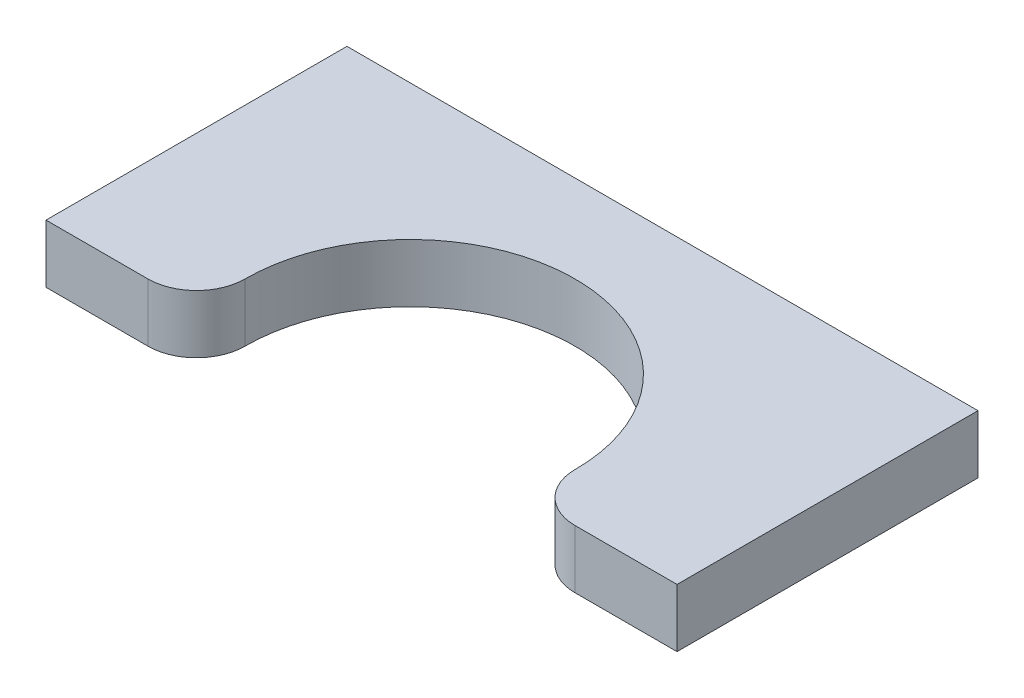
ISO-10303-21;
HEADER;
FILE_DESCRIPTION(('STEP AP214'),'2;1');
FILE_NAME('part.step','',(''),(''),'','','');
FILE_SCHEMA(('AUTOMOTIVE_DESIGN { 1 0 10303 214 1 1 1 1 }'));
ENDSEC;
DATA;
#1=APPLICATION_CONTEXT('core data for automotive mechanical design processes');
#2=APPLICATION_PROTOCOL_DEFINITION('international standard','automotive_design',2000,#1);
#3=PRODUCT_CONTEXT('',#1,'mechanical');
#4=PRODUCT('Part','Part','',(#3));
#5=PRODUCT_RELATED_PRODUCT_CATEGORY('part','',(#4));
#6=PRODUCT_DEFINITION_FORMATION('','',#4);
#7=PRODUCT_DEFINITION_CONTEXT('part definition',#1,'design');
#8=PRODUCT_DEFINITION('design','',#6,#7);
#9=PRODUCT_DEFINITION_SHAPE('','',#8);
#10=(LENGTH_UNIT() NAMED_UNIT(*) SI_UNIT(.MILLI.,.METRE.));
#11=(NAMED_UNIT(*) PLANE_ANGLE_UNIT() SI_UNIT($,.RADIAN.));
#12=(NAMED_UNIT(*) SI_UNIT($,.STERADIAN.) SOLID_ANGLE_UNIT());
#13=UNCERTAINTY_MEASURE_WITH_UNIT(LENGTH_MEASURE(1.E-05),#10,'distance_accuracy_value','');
#14=(GEOMETRIC_REPRESENTATION_CONTEXT(3) GLOBAL_UNCERTAINTY_ASSIGNED_CONTEXT((#13)) GLOBAL_UNIT_ASSIGNED_CONTEXT((#10,
#11,#12)) REPRESENTATION_CONTEXT('',''));
#15=CARTESIAN_POINT('',(0.,0.,0.));
#16=DIRECTION('',(0.,0.,1.));
#17=DIRECTION('',(1.,0.,0.));
#18=AXIS2_PLACEMENT_3D('',#15,#16,#17);
#19=CARTESIAN_POINT('',(32.5,-3.,15.5));
#20=DIRECTION('',(1.,0.,0.));
#21=DIRECTION('',(0.,0.,-1.));
#22=AXIS2_PLACEMENT_3D('',#19,#20,#21);
#23=PLANE('',#22);
#24=DIRECTION('',(0.,1.,0.));
#25=VECTOR('',#24,1.);
#26=CARTESIAN_POINT('',(32.5,-3.,-15.5));
#27=LINE('',#26,#25);
#28=CARTESIAN_POINT('',(32.5,-3.,-15.5));
#29=VERTEX_POINT('',#28);
#30=CARTESIAN_POINT('',(32.5,3.,-15.5));
#31=VERTEX_POINT('',#30);
#32=EDGE_CURVE('E102',#29,#31,#27,.T.);
#33=ORIENTED_EDGE('',*,*,#32,.T.);
#34=DIRECTION('',(0.,0.,-1.));
#35=VECTOR('',#34,1.);
#36=CARTESIAN_POINT('',(32.5,3.,15.5));
#37=LINE('',#36,#35);
#38=CARTESIAN_POINT('',(32.5,3.,15.5));
#39=VERTEX_POINT('',#38);
#40=EDGE_CURVE('E106',#39,#31,#37,.T.);
#41=ORIENTED_EDGE('',*,*,#40,.F.);
#42=DIRECTION('',(0.,1.,0.));
#43=VECTOR('',#42,1.);
#44=CARTESIAN_POINT('',(32.5,-3.,15.5));
#45=LINE('',#44,#43);
#46=CARTESIAN_POINT('',(32.5,-3.,15.5));
#47=VERTEX_POINT('',#46);
#48=EDGE_CURVE('E148',#47,#39,#45,.T.);
#49=ORIENTED_EDGE('',*,*,#48,.F.);
#50=DIRECTION('',(0.,0.,-1.));
#51=VECTOR('',#50,1.);
#52=CARTESIAN_POINT('',(32.5,-3.,15.5));
#53=LINE('',#52,#51);
#54=EDGE_CURVE('E108',#47,#29,#53,.T.);
#55=ORIENTED_EDGE('',*,*,#54,.T.);
#56=EDGE_LOOP('',(#33,#41,#49,#55));
#57=FACE_BOUND('',#56,.T.);
#58=ADVANCED_FACE('F34',(#57),#23,.T.);
#59=CARTESIAN_POINT('',(16.2480768092719,-3.,15.5));
#60=DIRECTION('',(0.,0.,1.));
#61=DIRECTION('',(1.,0.,0.));
#62=AXIS2_PLACEMENT_3D('',#59,#60,#61);
#63=PLANE('',#62);
#64=DIRECTION('',(1.,0.,0.));
#65=VECTOR('',#64,1.);
#66=CARTESIAN_POINT('',(16.2480768092719,3.,15.5));
#67=LINE('',#66,#65);
#68=CARTESIAN_POINT('',(22.,3.,15.5));
#69=VERTEX_POINT('',#68);
#70=EDGE_CURVE('E125',#69,#39,#67,.T.);
#71=ORIENTED_EDGE('',*,*,#70,.F.);
#72=DIRECTION('',(0.,1.,0.));
#73=VECTOR('',#72,1.);
#74=CARTESIAN_POINT('',(22.,-3.,15.5));
#75=LINE('',#74,#73);
#76=CARTESIAN_POINT('',(22.,-3.,15.5));
#77=VERTEX_POINT('',#76);
#78=EDGE_CURVE('E57',#69,#77,#75,.F.);
#79=ORIENTED_EDGE('',*,*,#78,.T.);
#80=DIRECTION('',(1.,0.,0.));
#81=VECTOR('',#80,1.);
#82=CARTESIAN_POINT('',(16.2480768092719,-3.,15.5));
#83=LINE('',#82,#81);
#84=EDGE_CURVE('E113',#77,#47,#83,.T.);
#85=ORIENTED_EDGE('',*,*,#84,.T.);
#86=ORIENTED_EDGE('',*,*,#48,.T.);
#87=EDGE_LOOP('',(#71,#79,#85,#86));
#88=FACE_BOUND('',#87,.T.);
#89=ADVANCED_FACE('F172',(#88),#63,.T.);
#90=CARTESIAN_POINT('',(0.,-3.,10.5));
#91=DIRECTION('',(0.,1.,0.));
#92=DIRECTION('',(0.,0.,1.));
#93=AXIS2_PLACEMENT_3D('',#90,#91,#92);
#94=CYLINDRICAL_SURFACE('',#93,17.);
#95=CARTESIAN_POINT('',(0.,-3.,10.5));
#96=DIRECTION('',(0.,-1.,0.));
#97=DIRECTION('',(0.,0.,1.));
#98=AXIS2_PLACEMENT_3D('',#95,#96,#97);
#99=CIRCLE('',#98,17.);
#100=CARTESIAN_POINT('',(-17.,-3.,10.5));
#101=VERTEX_POINT('',#100);
#102=CARTESIAN_POINT('',(17.,-3.,10.5));
#103=VERTEX_POINT('',#102);
#104=EDGE_CURVE('E144',#101,#103,#99,.T.);
#105=ORIENTED_EDGE('',*,*,#104,.T.);
#106=DIRECTION('',(0.,1.,0.));
#107=VECTOR('',#106,1.);
#108=CARTESIAN_POINT('',(17.,-3.,10.5));
#109=LINE('',#108,#107);
#110=CARTESIAN_POINT('',(17.,3.,10.5));
#111=VERTEX_POINT('',#110);
#112=EDGE_CURVE('E155',#103,#111,#109,.T.);
#113=ORIENTED_EDGE('',*,*,#112,.T.);
#114=CARTESIAN_POINT('',(0.,3.,10.5));
#115=DIRECTION('',(0.,-1.,0.));
#116=DIRECTION('',(0.,0.,1.));
#117=AXIS2_PLACEMENT_3D('',#114,#115,#116);
#118=CIRCLE('',#117,17.);
#119=CARTESIAN_POINT('',(-17.,3.,10.5));
#120=VERTEX_POINT('',#119);
#121=EDGE_CURVE('E133',#120,#111,#118,.T.);
#122=ORIENTED_EDGE('',*,*,#121,.F.);
#123=DIRECTION('',(0.,1.,0.));
#124=VECTOR('',#123,1.);
#125=CARTESIAN_POINT('',(-17.,-3.,10.5));
#126=LINE('',#125,#124);
#127=EDGE_CURVE('E150',#120,#101,#126,.F.);
#128=ORIENTED_EDGE('',*,*,#127,.T.);
#129=EDGE_LOOP('',(#105,#113,#122,#128));
#130=FACE_BOUND('',#129,.T.);
#131=ADVANCED_FACE('F168',(#130),#94,.F.);
#132=CARTESIAN_POINT('',(-32.5,-3.,15.5));
#133=DIRECTION('',(0.,0.,1.));
#134=DIRECTION('',(1.,0.,0.));
#135=AXIS2_PLACEMENT_3D('',#132,#133,#134);
#136=PLANE('',#135);
#137=DIRECTION('',(1.,0.,0.));
#138=VECTOR('',#137,1.);
#139=CARTESIAN_POINT('',(-32.5,-3.,15.5));
#140=LINE('',#139,#138);
#141=CARTESIAN_POINT('',(-32.5,-3.,15.5));
#142=VERTEX_POINT('',#141);
#143=CARTESIAN_POINT('',(-22.,-3.,15.5));
#144=VERTEX_POINT('',#143);
#145=EDGE_CURVE('E142',#142,#144,#140,.T.);
#146=ORIENTED_EDGE('',*,*,#145,.T.);
#147=DIRECTION('',(0.,1.,0.));
#148=VECTOR('',#147,1.);
#149=CARTESIAN_POINT('',(-22.,-3.,15.5));
#150=LINE('',#149,#148);
#151=CARTESIAN_POINT('',(-22.,3.,15.5));
#152=VERTEX_POINT('',#151);
#153=EDGE_CURVE('E11',#144,#152,#150,.T.);
#154=ORIENTED_EDGE('',*,*,#153,.T.);
#155=DIRECTION('',(1.,0.,0.));
#156=VECTOR('',#155,1.);
#157=CARTESIAN_POINT('',(-32.5,3.,15.5));
#158=LINE('',#157,#156);
#159=CARTESIAN_POINT('',(-32.5,3.,15.5));
#160=VERTEX_POINT('',#159);
#161=EDGE_CURVE('E130',#160,#152,#158,.T.);
#162=ORIENTED_EDGE('',*,*,#161,.F.);
#163=DIRECTION('',(0.,1.,0.));
#164=VECTOR('',#163,1.);
#165=CARTESIAN_POINT('',(-32.5,-3.,15.5));
#166=LINE('',#165,#164);
#167=EDGE_CURVE('E151',#142,#160,#166,.T.);
#168=ORIENTED_EDGE('',*,*,#167,.F.);
#169=EDGE_LOOP('',(#146,#154,#162,#168));
#170=FACE_BOUND('',#169,.T.);
#171=ADVANCED_FACE('F178',(#170),#136,.T.);
#172=CARTESIAN_POINT('',(-32.5,-3.,15.5));
#173=DIRECTION('',(-1.,0.,0.));
#174=DIRECTION('',(0.,0.,1.));
#175=AXIS2_PLACEMENT_3D('',#172,#173,#174);
#176=PLANE('',#175);
#177=ORIENTED_EDGE('',*,*,#167,.T.);
#178=DIRECTION('',(0.,0.,1.));
#179=VECTOR('',#178,1.);
#180=CARTESIAN_POINT('',(-32.5,3.,15.5));
#181=LINE('',#180,#179);
#182=CARTESIAN_POINT('',(-32.5,3.,-15.5));
#183=VERTEX_POINT('',#182);
#184=EDGE_CURVE('E121',#183,#160,#181,.T.);
#185=ORIENTED_EDGE('',*,*,#184,.F.);
#186=DIRECTION('',(0.,1.,0.));
#187=VECTOR('',#186,1.);
#188=CARTESIAN_POINT('',(-32.5,-3.,-15.5));
#189=LINE('',#188,#187);
#190=CARTESIAN_POINT('',(-32.5,-3.,-15.5));
#191=VERTEX_POINT('',#190);
#192=EDGE_CURVE('E112',#191,#183,#189,.T.);
#193=ORIENTED_EDGE('',*,*,#192,.F.);
#194=DIRECTION('',(0.,0.,1.));
#195=VECTOR('',#194,1.);
#196=CARTESIAN_POINT('',(-32.5,-3.,15.5));
#197=LINE('',#196,#195);
#198=EDGE_CURVE('E139',#191,#142,#197,.T.);
#199=ORIENTED_EDGE('',*,*,#198,.T.);
#200=EDGE_LOOP('',(#177,#185,#193,#199));
#201=FACE_BOUND('',#200,.T.);
#202=ADVANCED_FACE('F175',(#201),#176,.T.);
#203=CARTESIAN_POINT('',(-32.5,-3.,-15.5));
#204=DIRECTION('',(0.,0.,-1.));
#205=DIRECTION('',(-1.,0.,0.));
#206=AXIS2_PLACEMENT_3D('',#203,#204,#205);
#207=PLANE('',#206);
#208=ORIENTED_EDGE('',*,*,#192,.T.);
#209=DIRECTION('',(-1.,0.,0.));
#210=VECTOR('',#209,1.);
#211=CARTESIAN_POINT('',(-32.5,3.,-15.5));
#212=LINE('',#211,#210);
#213=EDGE_CURVE('E116',#31,#183,#212,.T.);
#214=ORIENTED_EDGE('',*,*,#213,.F.);
#215=ORIENTED_EDGE('',*,*,#32,.F.);
#216=DIRECTION('',(-1.,0.,0.));
#217=VECTOR('',#216,1.);
#218=CARTESIAN_POINT('',(-32.5,-3.,-15.5));
#219=LINE('',#218,#217);
#220=EDGE_CURVE('E137',#29,#191,#219,.T.);
#221=ORIENTED_EDGE('',*,*,#220,.T.);
#222=EDGE_LOOP('',(#208,#214,#215,#221));
#223=FACE_BOUND('',#222,.T.);
#224=ADVANCED_FACE('F117',(#223),#207,.T.);
#225=CARTESIAN_POINT('',(0.,-3.,10.5));
#226=DIRECTION('',(0.,1.,0.));
#227=DIRECTION('',(0.,0.,1.));
#228=AXIS2_PLACEMENT_3D('',#225,#226,#227);
#229=PLANE('',#228);
#230=ORIENTED_EDGE('',*,*,#84,.F.);
#231=CARTESIAN_POINT('',(22.,-3.,10.5));
#232=DIRECTION('',(0.,1.,0.));
#233=DIRECTION('',(0.,0.,1.));
#234=AXIS2_PLACEMENT_3D('',#231,#232,#233);
#235=CIRCLE('',#234,5.);
#236=EDGE_CURVE('E42',#77,#103,#235,.F.);
#237=ORIENTED_EDGE('',*,*,#236,.T.);
#238=ORIENTED_EDGE('',*,*,#104,.F.);
#239=CARTESIAN_POINT('',(-22.,-3.,10.5));
#240=DIRECTION('',(0.,1.,0.));
#241=DIRECTION('',(0.,0.,1.));
#242=AXIS2_PLACEMENT_3D('',#239,#240,#241);
#243=CIRCLE('',#242,5.);
#244=EDGE_CURVE('E49',#101,#144,#243,.F.);
#245=ORIENTED_EDGE('',*,*,#244,.T.);
#246=ORIENTED_EDGE('',*,*,#145,.F.);
#247=ORIENTED_EDGE('',*,*,#198,.F.);
#248=ORIENTED_EDGE('',*,*,#220,.F.);
#249=ORIENTED_EDGE('',*,*,#54,.F.);
#250=EDGE_LOOP('',(#230,#237,#238,#245,#246,#247,#248,#249));
#251=FACE_BOUND('',#250,.T.);
#252=ADVANCED_FACE('F164',(#251),#229,.F.);
#253=CARTESIAN_POINT('',(0.,3.,10.5));
#254=DIRECTION('',(0.,1.,0.));
#255=DIRECTION('',(0.,0.,1.));
#256=AXIS2_PLACEMENT_3D('',#253,#254,#255);
#257=PLANE('',#256);
#258=ORIENTED_EDGE('',*,*,#121,.T.);
#259=CARTESIAN_POINT('',(22.,3.,10.5));
#260=DIRECTION('',(0.,1.,0.));
#261=DIRECTION('',(0.,0.,1.));
#262=AXIS2_PLACEMENT_3D('',#259,#260,#261);
#263=CIRCLE('',#262,5.);
#264=EDGE_CURVE('E160',#111,#69,#263,.T.);
#265=ORIENTED_EDGE('',*,*,#264,.T.);
#266=ORIENTED_EDGE('',*,*,#70,.T.);
#267=ORIENTED_EDGE('',*,*,#40,.T.);
#268=ORIENTED_EDGE('',*,*,#213,.T.);
#269=ORIENTED_EDGE('',*,*,#184,.T.);
#270=ORIENTED_EDGE('',*,*,#161,.T.);
#271=CARTESIAN_POINT('',(-22.,3.,10.5));
#272=DIRECTION('',(0.,1.,0.));
#273=DIRECTION('',(0.,0.,1.));
#274=AXIS2_PLACEMENT_3D('',#271,#272,#273);
#275=CIRCLE('',#274,5.);
#276=EDGE_CURVE('E158',#152,#120,#275,.T.);
#277=ORIENTED_EDGE('',*,*,#276,.T.);
#278=EDGE_LOOP('',(#258,#265,#266,#267,#268,#269,#270,#277));
#279=FACE_BOUND('',#278,.T.);
#280=ADVANCED_FACE('F124',(#279),#257,.T.);
#281=CARTESIAN_POINT('',(22.,-3.,10.5));
#282=DIRECTION('',(0.,1.,0.));
#283=DIRECTION('',(0.,0.,1.));
#284=AXIS2_PLACEMENT_3D('',#281,#282,#283);
#285=CYLINDRICAL_SURFACE('',#284,5.);
#286=ORIENTED_EDGE('',*,*,#236,.F.);
#287=ORIENTED_EDGE('',*,*,#78,.F.);
#288=ORIENTED_EDGE('',*,*,#264,.F.);
#289=ORIENTED_EDGE('',*,*,#112,.F.);
#290=EDGE_LOOP('',(#286,#287,#288,#289));
#291=FACE_BOUND('',#290,.T.);
#292=ADVANCED_FACE('F171',(#291),#285,.T.);
#293=CARTESIAN_POINT('',(-22.,-3.,10.5));
#294=DIRECTION('',(0.,1.,0.));
#295=DIRECTION('',(0.,0.,1.));
#296=AXIS2_PLACEMENT_3D('',#293,#294,#295);
#297=CYLINDRICAL_SURFACE('',#296,5.);
#298=ORIENTED_EDGE('',*,*,#244,.F.);
#299=ORIENTED_EDGE('',*,*,#127,.F.);
#300=ORIENTED_EDGE('',*,*,#276,.F.);
#301=ORIENTED_EDGE('',*,*,#153,.F.);
#302=EDGE_LOOP('',(#298,#299,#300,#301));
#303=FACE_BOUND('',#302,.T.);
#304=ADVANCED_FACE('F36',(#303),#297,.T.);
#305=CLOSED_SHELL('',(#58,#89,#131,#171,#202,#224,#252,#280,#292,#304));
#306=MANIFOLD_SOLID_BREP('B2',#305);
#307=ADVANCED_BREP_SHAPE_REPRESENTATION('',(#18,#306),#14);
#308=SHAPE_DEFINITION_REPRESENTATION(#9,#307);
ENDSEC;
END-ISO-10303-21;
